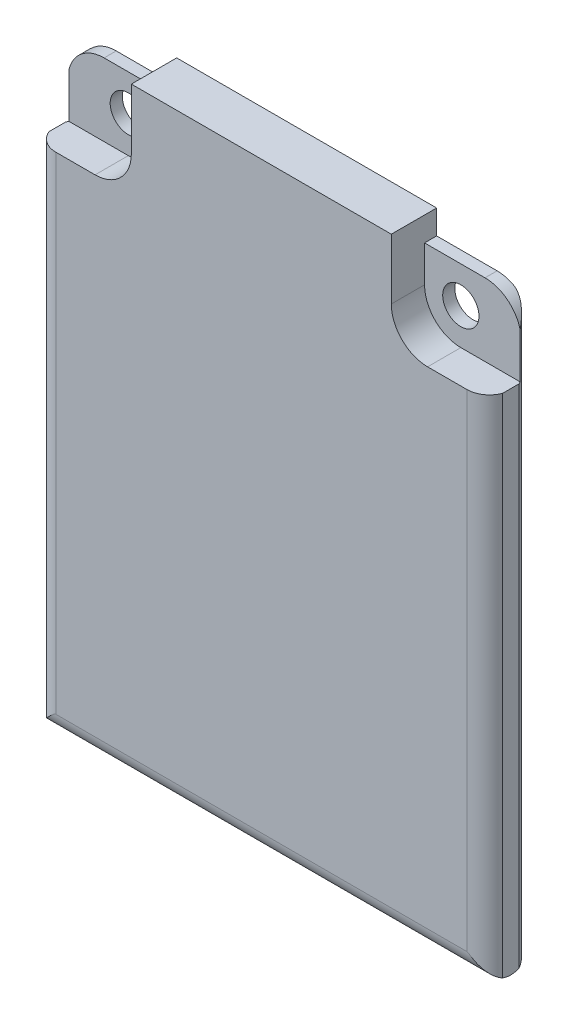
ISO-10303-21;
HEADER;
FILE_DESCRIPTION(('STEP AP214'),'2;1');
FILE_NAME('part.step','',(''),(''),'','','');
FILE_SCHEMA(('AUTOMOTIVE_DESIGN { 1 0 10303 214 1 1 1 1 }'));
ENDSEC;
DATA;
#1=APPLICATION_CONTEXT('core data for automotive mechanical design processes');
#2=APPLICATION_PROTOCOL_DEFINITION('international standard','automotive_design',2000,#1);
#3=PRODUCT_CONTEXT('',#1,'mechanical');
#4=PRODUCT('Part','Part','',(#3));
#5=PRODUCT_RELATED_PRODUCT_CATEGORY('part','',(#4));
#6=PRODUCT_DEFINITION_FORMATION('','',#4);
#7=PRODUCT_DEFINITION_CONTEXT('part definition',#1,'design');
#8=PRODUCT_DEFINITION('design','',#6,#7);
#9=PRODUCT_DEFINITION_SHAPE('','',#8);
#10=(LENGTH_UNIT() NAMED_UNIT(*) SI_UNIT(.MILLI.,.METRE.));
#11=(NAMED_UNIT(*) PLANE_ANGLE_UNIT() SI_UNIT($,.RADIAN.));
#12=(NAMED_UNIT(*) SI_UNIT($,.STERADIAN.) SOLID_ANGLE_UNIT());
#13=UNCERTAINTY_MEASURE_WITH_UNIT(LENGTH_MEASURE(1.E-05),#10,'distance_accuracy_value','');
#14=(GEOMETRIC_REPRESENTATION_CONTEXT(3) GLOBAL_UNCERTAINTY_ASSIGNED_CONTEXT((#13)) GLOBAL_UNIT_ASSIGNED_CONTEXT((#10,
#11,#12)) REPRESENTATION_CONTEXT('',''));
#15=CARTESIAN_POINT('',(0.,0.,0.));
#16=DIRECTION('',(0.,0.,1.));
#17=DIRECTION('',(1.,0.,0.));
#18=AXIS2_PLACEMENT_3D('',#15,#16,#17);
#19=CARTESIAN_POINT('',(0.,17.,3.75));
#20=DIRECTION('',(0.,-1.,0.));
#21=DIRECTION('',(1.,0.,0.));
#22=AXIS2_PLACEMENT_3D('',#19,#20,#21);
#23=PLANE('',#22);
#24=CARTESIAN_POINT('',(-17.,17.,1.875));
#25=DIRECTION('',(0.,-1.,0.));
#26=DIRECTION('',(1.,0.,0.));
#27=AXIS2_PLACEMENT_3D('',#24,#25,#26);
#28=CIRCLE('',#27,1.875);
#29=CARTESIAN_POINT('',(-17.,17.,3.75));
#30=VERTEX_POINT('',#29);
#31=CARTESIAN_POINT('',(-18.75,17.,2.54814560089184));
#32=VERTEX_POINT('',#31);
#33=EDGE_CURVE('E454',#30,#32,#28,.T.);
#34=ORIENTED_EDGE('',*,*,#33,.F.);
#35=DIRECTION('',(-1.,0.,0.));
#36=VECTOR('',#35,1.);
#37=CARTESIAN_POINT('',(0.,17.,3.75));
#38=LINE('',#37,#36);
#39=CARTESIAN_POINT('',(-13.75,17.,3.75));
#40=VERTEX_POINT('',#39);
#41=EDGE_CURVE('E272',#40,#30,#38,.T.);
#42=ORIENTED_EDGE('',*,*,#41,.F.);
#43=DIRECTION('',(0.,0.,-1.));
#44=VECTOR('',#43,1.);
#45=CARTESIAN_POINT('',(-13.75,17.,3.75));
#46=LINE('',#45,#44);
#47=CARTESIAN_POINT('',(-13.75,17.,1.));
#48=VERTEX_POINT('',#47);
#49=EDGE_CURVE('E309',#40,#48,#46,.T.);
#50=ORIENTED_EDGE('',*,*,#49,.T.);
#51=DIRECTION('',(-1.,0.,0.));
#52=VECTOR('',#51,1.);
#53=CARTESIAN_POINT('',(0.,17.,1.));
#54=LINE('',#53,#52);
#55=CARTESIAN_POINT('',(-18.6583123951777,17.,1.));
#56=VERTEX_POINT('',#55);
#57=EDGE_CURVE('E400',#48,#56,#54,.T.);
#58=ORIENTED_EDGE('',*,*,#57,.T.);
#59=CARTESIAN_POINT('',(-18.75,17.,1.20185439910816));
#60=VERTEX_POINT('',#59);
#61=EDGE_CURVE('E452',#60,#56,#28,.T.);
#62=ORIENTED_EDGE('',*,*,#61,.F.);
#63=DIRECTION('',(0.,0.,-1.));
#64=VECTOR('',#63,1.);
#65=CARTESIAN_POINT('',(-18.75,17.,3.75));
#66=LINE('',#65,#64);
#67=EDGE_CURVE('E306',#32,#60,#66,.T.);
#68=ORIENTED_EDGE('',*,*,#67,.F.);
#69=EDGE_LOOP('',(#34,#42,#50,#58,#62,#68));
#70=FACE_BOUND('',#69,.T.);
#71=ADVANCED_FACE('F52',(#70),#23,.F.);
#72=CARTESIAN_POINT('',(-18.75,0.,3.75));
#73=DIRECTION('',(1.,0.,0.));
#74=DIRECTION('',(0.,1.,0.));
#75=AXIS2_PLACEMENT_3D('',#72,#73,#74);
#76=PLANE('',#75);
#77=DIRECTION('',(0.,1.,0.));
#78=VECTOR('',#77,1.);
#79=CARTESIAN_POINT('',(-18.75,-25.,1.20185439910816));
#80=LINE('',#79,#78);
#81=CARTESIAN_POINT('',(-18.75,-24.8753560892309,1.20185439910816));
#82=VERTEX_POINT('',#81);
#83=EDGE_CURVE('E483',#82,#60,#80,.T.);
#84=ORIENTED_EDGE('',*,*,#83,.F.);
#85=CARTESIAN_POINT('',(-18.75,-23.12,1.875));
#86=DIRECTION('',(-1.,0.,0.));
#87=DIRECTION('',(0.,-1.,0.));
#88=AXIS2_PLACEMENT_3D('',#85,#86,#87);
#89=CIRCLE('',#88,1.88);
#90=CARTESIAN_POINT('',(-18.75,-24.8753560892309,2.54814560089184));
#91=VERTEX_POINT('',#90);
#92=EDGE_CURVE('E387',#91,#82,#89,.F.);
#93=ORIENTED_EDGE('',*,*,#92,.F.);
#94=DIRECTION('',(0.,1.,0.));
#95=VECTOR('',#94,1.);
#96=CARTESIAN_POINT('',(-18.75,-25.,2.54814560089184));
#97=LINE('',#96,#95);
#98=EDGE_CURVE('E202',#32,#91,#97,.F.);
#99=ORIENTED_EDGE('',*,*,#98,.F.);
#100=ORIENTED_EDGE('',*,*,#67,.T.);
#101=EDGE_LOOP('',(#84,#93,#99,#100));
#102=FACE_BOUND('',#101,.T.);
#103=ADVANCED_FACE('F420',(#102),#76,.F.);
#104=CARTESIAN_POINT('',(18.75,0.,3.75));
#105=DIRECTION('',(-1.,0.,0.));
#106=DIRECTION('',(0.,-1.,0.));
#107=AXIS2_PLACEMENT_3D('',#104,#105,#106);
#108=PLANE('',#107);
#109=DIRECTION('',(0.,1.,0.));
#110=VECTOR('',#109,1.);
#111=CARTESIAN_POINT('',(18.75,-25.,2.5481456008918));
#112=LINE('',#111,#110);
#113=CARTESIAN_POINT('',(18.75,-24.8753560892309,2.5481456008918));
#114=VERTEX_POINT('',#113);
#115=CARTESIAN_POINT('',(18.75,17.,2.5481456008918));
#116=VERTEX_POINT('',#115);
#117=EDGE_CURVE('E478',#114,#116,#112,.T.);
#118=ORIENTED_EDGE('',*,*,#117,.F.);
#119=CARTESIAN_POINT('',(18.75,-23.12,1.875));
#120=DIRECTION('',(-1.,0.,0.));
#121=DIRECTION('',(0.,-1.,0.));
#122=AXIS2_PLACEMENT_3D('',#119,#120,#121);
#123=CIRCLE('',#122,1.88);
#124=CARTESIAN_POINT('',(18.75,-24.8753560892309,1.20185439910819));
#125=VERTEX_POINT('',#124);
#126=EDGE_CURVE('E388',#114,#125,#123,.F.);
#127=ORIENTED_EDGE('',*,*,#126,.T.);
#128=DIRECTION('',(0.,1.,0.));
#129=VECTOR('',#128,1.);
#130=CARTESIAN_POINT('',(18.75,-25.,1.20185439910819));
#131=LINE('',#130,#129);
#132=CARTESIAN_POINT('',(18.75,17.,1.20185439910819));
#133=VERTEX_POINT('',#132);
#134=EDGE_CURVE('E79',#133,#125,#131,.F.);
#135=ORIENTED_EDGE('',*,*,#134,.F.);
#136=DIRECTION('',(0.,0.,-1.));
#137=VECTOR('',#136,1.);
#138=CARTESIAN_POINT('',(18.75,17.,3.75));
#139=LINE('',#138,#137);
#140=EDGE_CURVE('E303',#116,#133,#139,.T.);
#141=ORIENTED_EDGE('',*,*,#140,.F.);
#142=EDGE_LOOP('',(#118,#127,#135,#141));
#143=FACE_BOUND('',#142,.T.);
#144=ADVANCED_FACE('F426',(#143),#108,.F.);
#145=CARTESIAN_POINT('',(0.,17.,3.75));
#146=DIRECTION('',(0.,1.,0.));
#147=DIRECTION('',(0.,0.,1.));
#148=AXIS2_PLACEMENT_3D('',#145,#146,#147);
#149=PLANE('',#148);
#150=DIRECTION('',(1.,0.,0.));
#151=VECTOR('',#150,1.);
#152=CARTESIAN_POINT('',(0.,17.,3.75));
#153=LINE('',#152,#151);
#154=CARTESIAN_POINT('',(13.75,17.,3.75));
#155=VERTEX_POINT('',#154);
#156=CARTESIAN_POINT('',(17.,17.,3.75));
#157=VERTEX_POINT('',#156);
#158=EDGE_CURVE('E275',#155,#157,#153,.T.);
#159=ORIENTED_EDGE('',*,*,#158,.T.);
#160=CARTESIAN_POINT('',(17.,17.,1.875));
#161=DIRECTION('',(0.,1.,0.));
#162=DIRECTION('',(0.,0.,1.));
#163=AXIS2_PLACEMENT_3D('',#160,#161,#162);
#164=CIRCLE('',#163,1.875);
#165=EDGE_CURVE('E475',#157,#116,#164,.T.);
#166=ORIENTED_EDGE('',*,*,#165,.T.);
#167=ORIENTED_EDGE('',*,*,#140,.T.);
#168=CARTESIAN_POINT('',(18.6583123951777,17.,1.));
#169=VERTEX_POINT('',#168);
#170=EDGE_CURVE('E473',#133,#169,#164,.T.);
#171=ORIENTED_EDGE('',*,*,#170,.T.);
#172=DIRECTION('',(1.,0.,0.));
#173=VECTOR('',#172,1.);
#174=CARTESIAN_POINT('',(0.,17.,1.));
#175=LINE('',#174,#173);
#176=CARTESIAN_POINT('',(13.75,17.,1.));
#177=VERTEX_POINT('',#176);
#178=EDGE_CURVE('E247',#177,#169,#175,.T.);
#179=ORIENTED_EDGE('',*,*,#178,.F.);
#180=DIRECTION('',(0.,0.,-1.));
#181=VECTOR('',#180,1.);
#182=CARTESIAN_POINT('',(13.75,17.,3.75));
#183=LINE('',#182,#181);
#184=EDGE_CURVE('E300',#155,#177,#183,.T.);
#185=ORIENTED_EDGE('',*,*,#184,.F.);
#186=EDGE_LOOP('',(#159,#166,#167,#171,#179,#185));
#187=FACE_BOUND('',#186,.T.);
#188=ADVANCED_FACE('F416',(#187),#149,.T.);
#189=CARTESIAN_POINT('',(0.,0.,3.75));
#190=DIRECTION('',(0.,0.,1.));
#191=DIRECTION('',(1.,0.,0.));
#192=AXIS2_PLACEMENT_3D('',#189,#190,#191);
#193=PLANE('',#192);
#194=DIRECTION('',(-1.,0.,0.));
#195=VECTOR('',#194,1.);
#196=CARTESIAN_POINT('',(18.75,-23.2570218960605,3.75));
#197=LINE('',#196,#195);
#198=CARTESIAN_POINT('',(17.,-23.2570218960605,3.75));
#199=VERTEX_POINT('',#198);
#200=CARTESIAN_POINT('',(-17.,-23.2570218960604,3.75));
#201=VERTEX_POINT('',#200);
#202=EDGE_CURVE('E391',#199,#201,#197,.T.);
#203=ORIENTED_EDGE('',*,*,#202,.F.);
#204=DIRECTION('',(0.,1.,0.));
#205=VECTOR('',#204,1.);
#206=CARTESIAN_POINT('',(17.,-25.,3.75));
#207=LINE('',#206,#205);
#208=EDGE_CURVE('E72',#199,#157,#207,.T.);
#209=ORIENTED_EDGE('',*,*,#208,.T.);
#210=ORIENTED_EDGE('',*,*,#158,.F.);
#211=CARTESIAN_POINT('',(13.75,20.,3.75));
#212=DIRECTION('',(0.,0.,1.));
#213=DIRECTION('',(1.,0.,0.));
#214=AXIS2_PLACEMENT_3D('',#211,#212,#213);
#215=CIRCLE('',#214,3.);
#216=CARTESIAN_POINT('',(10.75,20.,3.75));
#217=VERTEX_POINT('',#216);
#218=EDGE_CURVE('E278',#217,#155,#215,.T.);
#219=ORIENTED_EDGE('',*,*,#218,.F.);
#220=DIRECTION('',(0.,-1.,0.));
#221=VECTOR('',#220,1.);
#222=CARTESIAN_POINT('',(10.75,0.,3.75));
#223=LINE('',#222,#221);
#224=CARTESIAN_POINT('',(10.75,25.,3.75));
#225=VERTEX_POINT('',#224);
#226=EDGE_CURVE('E281',#225,#217,#223,.T.);
#227=ORIENTED_EDGE('',*,*,#226,.F.);
#228=DIRECTION('',(1.,0.,0.));
#229=VECTOR('',#228,1.);
#230=CARTESIAN_POINT('',(0.,25.,3.75));
#231=LINE('',#230,#229);
#232=CARTESIAN_POINT('',(-10.75,25.,3.75));
#233=VERTEX_POINT('',#232);
#234=EDGE_CURVE('E284',#233,#225,#231,.T.);
#235=ORIENTED_EDGE('',*,*,#234,.F.);
#236=DIRECTION('',(0.,-1.,0.));
#237=VECTOR('',#236,1.);
#238=CARTESIAN_POINT('',(-10.75,0.,3.75));
#239=LINE('',#238,#237);
#240=CARTESIAN_POINT('',(-10.75,20.,3.75));
#241=VERTEX_POINT('',#240);
#242=EDGE_CURVE('E266',#233,#241,#239,.T.);
#243=ORIENTED_EDGE('',*,*,#242,.T.);
#244=CARTESIAN_POINT('',(-13.75,20.,3.75));
#245=DIRECTION('',(0.,0.,1.));
#246=DIRECTION('',(1.,0.,0.));
#247=AXIS2_PLACEMENT_3D('',#244,#245,#246);
#248=CIRCLE('',#247,3.);
#249=EDGE_CURVE('E269',#241,#40,#248,.F.);
#250=ORIENTED_EDGE('',*,*,#249,.T.);
#251=ORIENTED_EDGE('',*,*,#41,.T.);
#252=DIRECTION('',(0.,1.,0.));
#253=VECTOR('',#252,1.);
#254=CARTESIAN_POINT('',(-17.,-25.,3.75));
#255=LINE('',#254,#253);
#256=EDGE_CURVE('E213',#201,#30,#255,.T.);
#257=ORIENTED_EDGE('',*,*,#256,.F.);
#258=EDGE_LOOP('',(#203,#209,#210,#219,#227,#235,#243,#250,#251,#257));
#259=FACE_BOUND('',#258,.T.);
#260=ADVANCED_FACE('F374',(#259),#193,.T.);
#261=CARTESIAN_POINT('',(0.,0.,0.));
#262=DIRECTION('',(0.,0.,1.));
#263=DIRECTION('',(1.,0.,0.));
#264=AXIS2_PLACEMENT_3D('',#261,#262,#263);
#265=PLANE('',#264);
#266=CARTESIAN_POINT('',(-13.75,20.,0.));
#267=DIRECTION('',(0.,0.,1.));
#268=DIRECTION('',(1.,0.,0.));
#269=AXIS2_PLACEMENT_3D('',#266,#267,#268);
#270=CIRCLE('',#269,1.5);
#271=CARTESIAN_POINT('',(-12.25,20.,0.));
#272=VERTEX_POINT('',#271);
#273=EDGE_CURVE('E226',#272,#272,#270,.T.);
#274=ORIENTED_EDGE('',*,*,#273,.T.);
#275=EDGE_LOOP('',(#274));
#276=FACE_BOUND('',#275,.T.);
#277=CARTESIAN_POINT('',(13.75,20.,0.));
#278=DIRECTION('',(0.,0.,1.));
#279=DIRECTION('',(1.,0.,0.));
#280=AXIS2_PLACEMENT_3D('',#277,#278,#279);
#281=CIRCLE('',#280,1.5);
#282=CARTESIAN_POINT('',(15.25,20.,0.));
#283=VERTEX_POINT('',#282);
#284=EDGE_CURVE('E240',#283,#283,#281,.T.);
#285=ORIENTED_EDGE('',*,*,#284,.T.);
#286=EDGE_LOOP('',(#285));
#287=FACE_BOUND('',#286,.T.);
#288=DIRECTION('',(0.,1.,0.));
#289=VECTOR('',#288,1.);
#290=CARTESIAN_POINT('',(17.,-25.,0.));
#291=LINE('',#290,#289);
#292=CARTESIAN_POINT('',(17.,-23.2570218960604,0.));
#293=VERTEX_POINT('',#292);
#294=CARTESIAN_POINT('',(17.,22.7271780286589,0.));
#295=VERTEX_POINT('',#294);
#296=EDGE_CURVE('E214',#293,#295,#291,.T.);
#297=ORIENTED_EDGE('',*,*,#296,.F.);
#298=DIRECTION('',(-1.,0.,0.));
#299=VECTOR('',#298,1.);
#300=CARTESIAN_POINT('',(18.75,-23.2570218960604,0.));
#301=LINE('',#300,#299);
#302=CARTESIAN_POINT('',(-17.,-23.2570218960604,0.));
#303=VERTEX_POINT('',#302);
#304=EDGE_CURVE('E212',#293,#303,#301,.T.);
#305=ORIENTED_EDGE('',*,*,#304,.T.);
#306=DIRECTION('',(0.,1.,0.));
#307=VECTOR('',#306,1.);
#308=CARTESIAN_POINT('',(-17.,-25.,0.));
#309=LINE('',#308,#307);
#310=CARTESIAN_POINT('',(-17.,22.7271780286589,0.));
#311=VERTEX_POINT('',#310);
#312=EDGE_CURVE('E195',#303,#311,#309,.T.);
#313=ORIENTED_EDGE('',*,*,#312,.T.);
#314=CARTESIAN_POINT('',(-15.75,20.,0.));
#315=DIRECTION('',(0.,0.,1.));
#316=DIRECTION('',(1.,0.,0.));
#317=AXIS2_PLACEMENT_3D('',#314,#315,#316);
#318=CIRCLE('',#317,3.);
#319=CARTESIAN_POINT('',(-15.75,23.,0.));
#320=VERTEX_POINT('',#319);
#321=EDGE_CURVE('E209',#320,#311,#318,.T.);
#322=ORIENTED_EDGE('',*,*,#321,.F.);
#323=DIRECTION('',(-1.,0.,0.));
#324=VECTOR('',#323,1.);
#325=CARTESIAN_POINT('',(0.,23.,0.));
#326=LINE('',#325,#324);
#327=CARTESIAN_POINT('',(-10.75,23.,0.));
#328=VERTEX_POINT('',#327);
#329=EDGE_CURVE('E221',#328,#320,#326,.T.);
#330=ORIENTED_EDGE('',*,*,#329,.F.);
#331=DIRECTION('',(0.,-1.,0.));
#332=VECTOR('',#331,1.);
#333=CARTESIAN_POINT('',(-10.75,0.,0.));
#334=LINE('',#333,#332);
#335=CARTESIAN_POINT('',(-10.75,25.,0.));
#336=VERTEX_POINT('',#335);
#337=EDGE_CURVE('E265',#336,#328,#334,.T.);
#338=ORIENTED_EDGE('',*,*,#337,.F.);
#339=DIRECTION('',(1.,0.,0.));
#340=VECTOR('',#339,1.);
#341=CARTESIAN_POINT('',(0.,25.,0.));
#342=LINE('',#341,#340);
#343=CARTESIAN_POINT('',(10.75,25.,0.));
#344=VERTEX_POINT('',#343);
#345=EDGE_CURVE('E270',#336,#344,#342,.T.);
#346=ORIENTED_EDGE('',*,*,#345,.T.);
#347=DIRECTION('',(0.,-1.,0.));
#348=VECTOR('',#347,1.);
#349=CARTESIAN_POINT('',(10.75,0.,0.));
#350=LINE('',#349,#348);
#351=CARTESIAN_POINT('',(10.75,23.,0.));
#352=VERTEX_POINT('',#351);
#353=EDGE_CURVE('E289',#344,#352,#350,.T.);
#354=ORIENTED_EDGE('',*,*,#353,.T.);
#355=DIRECTION('',(1.,0.,0.));
#356=VECTOR('',#355,1.);
#357=CARTESIAN_POINT('',(0.,23.,0.));
#358=LINE('',#357,#356);
#359=CARTESIAN_POINT('',(15.75,23.,0.));
#360=VERTEX_POINT('',#359);
#361=EDGE_CURVE('E256',#352,#360,#358,.T.);
#362=ORIENTED_EDGE('',*,*,#361,.T.);
#363=CARTESIAN_POINT('',(15.75,20.,0.));
#364=DIRECTION('',(0.,0.,1.));
#365=DIRECTION('',(1.,0.,0.));
#366=AXIS2_PLACEMENT_3D('',#363,#364,#365);
#367=CIRCLE('',#366,3.);
#368=EDGE_CURVE('E235',#360,#295,#367,.F.);
#369=ORIENTED_EDGE('',*,*,#368,.T.);
#370=EDGE_LOOP('',(#297,#305,#313,#322,#330,#338,#346,#354,#362,#369));
#371=FACE_BOUND('',#370,.T.);
#372=ADVANCED_FACE('F207',(#276,#287,#371),#265,.F.);
#373=CARTESIAN_POINT('',(15.75,20.,1.));
#374=DIRECTION('',(0.,0.,-1.));
#375=DIRECTION('',(-1.,0.,0.));
#376=AXIS2_PLACEMENT_3D('',#373,#374,#375);
#377=CYLINDRICAL_SURFACE('',#376,3.);
#378=CARTESIAN_POINT('',(15.75,20.,1.));
#379=DIRECTION('',(0.,0.,1.));
#380=DIRECTION('',(1.,0.,0.));
#381=AXIS2_PLACEMENT_3D('',#378,#379,#380);
#382=CIRCLE('',#381,3.);
#383=CARTESIAN_POINT('',(15.75,23.,1.));
#384=VERTEX_POINT('',#383);
#385=CARTESIAN_POINT('',(18.6583123951777,20.736015633024,1.));
#386=VERTEX_POINT('',#385);
#387=EDGE_CURVE('E236',#384,#386,#382,.F.);
#388=ORIENTED_EDGE('',*,*,#387,.T.);
#389=CARTESIAN_POINT('',(18.6583123951777,20.736015633024,1.));
#390=CARTESIAN_POINT('',(18.6469151633582,20.7810265436928,0.978383695070677));
#391=CARTESIAN_POINT('',(18.6345741281256,20.8254230698185,0.956034489208237));
#392=CARTESIAN_POINT('',(18.6080273215763,20.9131190163062,0.910342448061663));
#393=CARTESIAN_POINT('',(18.5938220945094,20.9564187524906,0.886999904120916));
#394=CARTESIAN_POINT('',(18.5484154287706,21.0849603826171,0.816141992165832));
#395=CARTESIAN_POINT('',(18.5144367515276,21.1687909358852,0.767823448373397));
#396=CARTESIAN_POINT('',(18.4383765760621,21.3345726008704,0.670598098308575));
#397=CARTESIAN_POINT('',(18.3961656860059,21.4164665338406,0.621695480188995));
#398=CARTESIAN_POINT('',(18.3038292900456,21.5768681038966,0.52589657173632));
#399=CARTESIAN_POINT('',(18.2537076982671,21.6553773913365,0.47899930368682));
#400=CARTESIAN_POINT('',(18.1606629597488,21.7869584859985,0.401555582287939));
#401=CARTESIAN_POINT('',(18.1197307675557,21.8409288575326,0.37014451870001));
#402=CARTESIAN_POINT('',(18.0336072503825,21.9467413090445,0.309735714320903));
#403=CARTESIAN_POINT('',(17.9884162429722,21.998583547299,0.280737793890534));
#404=CARTESIAN_POINT('',(17.8471425291157,22.1496089798837,0.198774479552232));
#405=CARTESIAN_POINT('',(17.744575068301,22.2454147884618,0.150159806075704));
#406=CARTESIAN_POINT('',(17.5868443545237,22.3726908445298,0.0935023633313473));
#407=CARTESIAN_POINT('',(17.5383864832457,22.4094448074854,0.0782151697380043));
#408=CARTESIAN_POINT('',(17.4386503271966,22.4803624509439,0.0513015649321507));
#409=CARTESIAN_POINT('',(17.3873735795584,22.5145275194634,0.0396731813812024));
#410=CARTESIAN_POINT('',(17.2814367440185,22.5804348733538,0.0204496784019765));
#411=CARTESIAN_POINT('',(17.226737280868,22.6121328253313,0.0129180611049755));
#412=CARTESIAN_POINT('',(17.1149964531235,22.6722355851597,0.00268532096589317));
#413=CARTESIAN_POINT('',(17.0579508701185,22.7006340755424,-6.67353141690896E-06));
#414=CARTESIAN_POINT('',(17.,22.7271780286589,0.));
#415=B_SPLINE_CURVE_WITH_KNOTS('',3,(#389,#390,#391,#392,#393,#394,#395,#396,#397,#398,#399,
#400,#401,#402,#403,#404,#405,#406,#407,#408,#409,#410,#411,#412,#413,#414),.UNSPECIFIED.,.F.,
.F.,(4,2,2,2,2,2,2,2,2,2,2,2,4),(0.,0.15359993157319,0.307155119077245,0.614450141504304,
0.927033987337207,1.23946365230341,1.46327051822214,1.68706070857961,2.13009201440242,
2.31805766165528,2.50592180881527,2.69662049594543,2.88767849708265),.UNSPECIFIED.);
#416=EDGE_CURVE('E377',#386,#295,#415,.T.);
#417=ORIENTED_EDGE('',*,*,#416,.T.);
#418=ORIENTED_EDGE('',*,*,#368,.F.);
#419=DIRECTION('',(0.,0.,-1.));
#420=VECTOR('',#419,1.);
#421=CARTESIAN_POINT('',(15.75,23.,1.));
#422=LINE('',#421,#420);
#423=EDGE_CURVE('E263',#384,#360,#422,.T.);
#424=ORIENTED_EDGE('',*,*,#423,.F.);
#425=EDGE_LOOP('',(#388,#417,#418,#424));
#426=FACE_BOUND('',#425,.T.);
#427=ADVANCED_FACE('F360',(#426),#377,.T.);
#428=CARTESIAN_POINT('',(0.,0.,1.));
#429=DIRECTION('',(0.,0.,1.));
#430=DIRECTION('',(1.,0.,0.));
#431=AXIS2_PLACEMENT_3D('',#428,#429,#430);
#432=PLANE('',#431);
#433=CARTESIAN_POINT('',(13.75,20.,1.));
#434=DIRECTION('',(0.,0.,1.));
#435=DIRECTION('',(1.,0.,0.));
#436=AXIS2_PLACEMENT_3D('',#433,#434,#435);
#437=CIRCLE('',#436,1.5);
#438=CARTESIAN_POINT('',(15.25,20.,1.));
#439=VERTEX_POINT('',#438);
#440=EDGE_CURVE('E250',#439,#439,#437,.T.);
#441=ORIENTED_EDGE('',*,*,#440,.F.);
#442=EDGE_LOOP('',(#441));
#443=FACE_BOUND('',#442,.T.);
#444=ORIENTED_EDGE('',*,*,#178,.T.);
#445=DIRECTION('',(0.,1.,0.));
#446=VECTOR('',#445,1.);
#447=CARTESIAN_POINT('',(18.6583123951777,-25.,1.));
#448=LINE('',#447,#446);
#449=EDGE_CURVE('E384',#169,#386,#448,.T.);
#450=ORIENTED_EDGE('',*,*,#449,.T.);
#451=ORIENTED_EDGE('',*,*,#387,.F.);
#452=DIRECTION('',(1.,0.,0.));
#453=VECTOR('',#452,1.);
#454=CARTESIAN_POINT('',(0.,23.,1.));
#455=LINE('',#454,#453);
#456=CARTESIAN_POINT('',(10.75,23.,1.));
#457=VERTEX_POINT('',#456);
#458=EDGE_CURVE('E239',#457,#384,#455,.T.);
#459=ORIENTED_EDGE('',*,*,#458,.F.);
#460=DIRECTION('',(0.,-1.,0.));
#461=VECTOR('',#460,1.);
#462=CARTESIAN_POINT('',(10.75,0.,1.));
#463=LINE('',#462,#461);
#464=CARTESIAN_POINT('',(10.75,20.,1.));
#465=VERTEX_POINT('',#464);
#466=EDGE_CURVE('E243',#457,#465,#463,.T.);
#467=ORIENTED_EDGE('',*,*,#466,.T.);
#468=CARTESIAN_POINT('',(13.75,20.,1.));
#469=DIRECTION('',(0.,0.,1.));
#470=DIRECTION('',(1.,0.,0.));
#471=AXIS2_PLACEMENT_3D('',#468,#469,#470);
#472=CIRCLE('',#471,3.);
#473=EDGE_CURVE('E245',#465,#177,#472,.T.);
#474=ORIENTED_EDGE('',*,*,#473,.T.);
#475=EDGE_LOOP('',(#444,#450,#451,#459,#467,#474));
#476=FACE_BOUND('',#475,.T.);
#477=ADVANCED_FACE('F348',(#443,#476),#432,.T.);
#478=CARTESIAN_POINT('',(-15.75,20.,1.));
#479=DIRECTION('',(0.,0.,-1.));
#480=DIRECTION('',(-1.,0.,0.));
#481=AXIS2_PLACEMENT_3D('',#478,#479,#480);
#482=CYLINDRICAL_SURFACE('',#481,3.);
#483=CARTESIAN_POINT('',(-18.6583123951777,20.736015633024,1.));
#484=CARTESIAN_POINT('',(-18.6469151633582,20.7810265436928,0.978383695070677));
#485=CARTESIAN_POINT('',(-18.6345741281256,20.8254230698185,0.956034489208237));
#486=CARTESIAN_POINT('',(-18.6080273215763,20.9131190163062,0.910342448061662));
#487=CARTESIAN_POINT('',(-18.5938220945094,20.9564187524906,0.886999904120915));
#488=CARTESIAN_POINT('',(-18.5484154287706,21.0849603826171,0.81614199216583));
#489=CARTESIAN_POINT('',(-18.5144367515276,21.1687909358852,0.767823448373393));
#490=CARTESIAN_POINT('',(-18.4383765760621,21.3345726008704,0.670598098308571));
#491=CARTESIAN_POINT('',(-18.3961656860059,21.4164665338406,0.621695480188993));
#492=CARTESIAN_POINT('',(-18.3038292900455,21.5768681038966,0.525896571736318));
#493=CARTESIAN_POINT('',(-18.2537076982671,21.6553773913365,0.478999303686817));
#494=CARTESIAN_POINT('',(-18.1606629597488,21.7869584859985,0.401555582287937));
#495=CARTESIAN_POINT('',(-18.1197307675557,21.8409288575326,0.370144518700008));
#496=CARTESIAN_POINT('',(-18.0336072503825,21.9467413090445,0.309735714320902));
#497=CARTESIAN_POINT('',(-17.9884162429722,21.998583547299,0.280737793890532));
#498=CARTESIAN_POINT('',(-17.8471425291157,22.1496089798837,0.19877447955223));
#499=CARTESIAN_POINT('',(-17.744575068301,22.2454147884618,0.150159806075703));
#500=CARTESIAN_POINT('',(-17.5868443545237,22.3726908445298,0.093502363331348));
#501=CARTESIAN_POINT('',(-17.5383864832457,22.4094448074854,0.0782151697380058));
#502=CARTESIAN_POINT('',(-17.4386503271966,22.4803624509439,0.0513015649321533));
#503=CARTESIAN_POINT('',(-17.3873735795584,22.5145275194634,0.0396731813812055));
#504=CARTESIAN_POINT('',(-17.2814367440185,22.5804348733538,0.02044967840198));
#505=CARTESIAN_POINT('',(-17.226737280868,22.6121328253313,0.012918061104979));
#506=CARTESIAN_POINT('',(-17.1149964531235,22.6722355851597,0.00268532096589714));
#507=CARTESIAN_POINT('',(-17.0579508701185,22.7006340755424,-6.67353141270575E-06));
#508=CARTESIAN_POINT('',(-17.,22.7271780286589,0.));
#509=B_SPLINE_CURVE_WITH_KNOTS('',3,(#483,#484,#485,#486,#487,#488,#489,#490,#491,#492,#493,
#494,#495,#496,#497,#498,#499,#500,#501,#502,#503,#504,#505,#506,#507,#508),.UNSPECIFIED.,.F.,
.F.,(4,2,2,2,2,2,2,2,2,2,2,2,4),(0.,0.153599931573191,0.307155119077245,0.61445014150431,
0.927033987337209,1.23946365230342,1.46327051822215,1.68706070857962,2.13009201440242,
2.31805766165528,2.50592180881526,2.69662049594543,2.88767849708264),.UNSPECIFIED.);
#510=CARTESIAN_POINT('',(-18.6583123951777,20.736015633024,1.));
#511=VERTEX_POINT('',#510);
#512=EDGE_CURVE('E192',#511,#311,#509,.T.);
#513=ORIENTED_EDGE('',*,*,#512,.F.);
#514=CARTESIAN_POINT('',(-15.75,20.,1.));
#515=DIRECTION('',(0.,0.,1.));
#516=DIRECTION('',(1.,0.,0.));
#517=AXIS2_PLACEMENT_3D('',#514,#515,#516);
#518=CIRCLE('',#517,3.);
#519=CARTESIAN_POINT('',(-15.75,23.,1.));
#520=VERTEX_POINT('',#519);
#521=EDGE_CURVE('E398',#520,#511,#518,.T.);
#522=ORIENTED_EDGE('',*,*,#521,.F.);
#523=DIRECTION('',(0.,0.,-1.));
#524=VECTOR('',#523,1.);
#525=CARTESIAN_POINT('',(-15.75,23.,1.));
#526=LINE('',#525,#524);
#527=EDGE_CURVE('E218',#520,#320,#526,.T.);
#528=ORIENTED_EDGE('',*,*,#527,.T.);
#529=ORIENTED_EDGE('',*,*,#321,.T.);
#530=EDGE_LOOP('',(#513,#522,#528,#529));
#531=FACE_BOUND('',#530,.T.);
#532=ADVANCED_FACE('F216',(#531),#482,.T.);
#533=CARTESIAN_POINT('',(0.,0.,1.));
#534=DIRECTION('',(0.,0.,1.));
#535=DIRECTION('',(1.,0.,0.));
#536=AXIS2_PLACEMENT_3D('',#533,#534,#535);
#537=PLANE('',#536);
#538=CARTESIAN_POINT('',(-13.75,20.,1.));
#539=DIRECTION('',(0.,0.,1.));
#540=DIRECTION('',(1.,0.,0.));
#541=AXIS2_PLACEMENT_3D('',#538,#539,#540);
#542=CIRCLE('',#541,1.5);
#543=CARTESIAN_POINT('',(-12.25,20.,1.));
#544=VERTEX_POINT('',#543);
#545=EDGE_CURVE('E220',#544,#544,#542,.T.);
#546=ORIENTED_EDGE('',*,*,#545,.F.);
#547=EDGE_LOOP('',(#546));
#548=FACE_BOUND('',#547,.T.);
#549=ORIENTED_EDGE('',*,*,#521,.T.);
#550=DIRECTION('',(0.,1.,0.));
#551=VECTOR('',#550,1.);
#552=CARTESIAN_POINT('',(-18.6583123951777,-25.,1.));
#553=LINE('',#552,#551);
#554=EDGE_CURVE('E198',#511,#56,#553,.F.);
#555=ORIENTED_EDGE('',*,*,#554,.T.);
#556=ORIENTED_EDGE('',*,*,#57,.F.);
#557=CARTESIAN_POINT('',(-13.75,20.,1.));
#558=DIRECTION('',(0.,0.,1.));
#559=DIRECTION('',(1.,0.,0.));
#560=AXIS2_PLACEMENT_3D('',#557,#558,#559);
#561=CIRCLE('',#560,3.);
#562=CARTESIAN_POINT('',(-10.75,20.,1.));
#563=VERTEX_POINT('',#562);
#564=EDGE_CURVE('E403',#563,#48,#561,.F.);
#565=ORIENTED_EDGE('',*,*,#564,.F.);
#566=DIRECTION('',(0.,-1.,0.));
#567=VECTOR('',#566,1.);
#568=CARTESIAN_POINT('',(-10.75,0.,1.));
#569=LINE('',#568,#567);
#570=CARTESIAN_POINT('',(-10.75,23.,1.));
#571=VERTEX_POINT('',#570);
#572=EDGE_CURVE('E233',#571,#563,#569,.T.);
#573=ORIENTED_EDGE('',*,*,#572,.F.);
#574=DIRECTION('',(-1.,0.,0.));
#575=VECTOR('',#574,1.);
#576=CARTESIAN_POINT('',(0.,23.,1.));
#577=LINE('',#576,#575);
#578=EDGE_CURVE('E224',#571,#520,#577,.T.);
#579=ORIENTED_EDGE('',*,*,#578,.T.);
#580=EDGE_LOOP('',(#549,#555,#556,#565,#573,#579));
#581=FACE_BOUND('',#580,.T.);
#582=ADVANCED_FACE('F347',(#548,#581),#537,.T.);
#583=CARTESIAN_POINT('',(18.75,-23.12,1.875));
#584=DIRECTION('',(-1.,0.,0.));
#585=DIRECTION('',(0.,-1.,0.));
#586=AXIS2_PLACEMENT_3D('',#583,#584,#585);
#587=CYLINDRICAL_SURFACE('',#586,1.88);
#588=CARTESIAN_POINT('',(18.75,-24.8753560892309,1.20185439910819));
#589=CARTESIAN_POINT('',(18.7117527112968,-24.8372278428356,1.10250386429312));
#590=CARTESIAN_POINT('',(18.6663200711065,-24.7919393751637,1.00950115416613));
#591=CARTESIAN_POINT('',(18.5648084570247,-24.6907896616528,0.837262313778745));
#592=CARTESIAN_POINT('',(18.5088364553042,-24.6350346647198,0.757901992252526));
#593=CARTESIAN_POINT('',(18.3726270543176,-24.4994307249039,0.592023408824299));
#594=CARTESIAN_POINT('',(18.2899514726884,-24.4171743531407,0.509549060623657));
#595=CARTESIAN_POINT('',(18.1160033914361,-24.2443373123815,0.364015399672645));
#596=CARTESIAN_POINT('',(18.0246973504937,-24.1537242020175,0.301036273020345));
#597=CARTESIAN_POINT('',(17.8747368897741,-24.0053679963603,0.21529962744409));
#598=CARTESIAN_POINT('',(17.8178342216905,-23.9491745606764,0.186582295705263));
#599=CARTESIAN_POINT('',(17.7026211781936,-23.8357800244322,0.135486053150024));
#600=CARTESIAN_POINT('',(17.6443163946758,-23.7785831141415,0.113085418932045));
#601=CARTESIAN_POINT('',(17.5463638156595,-23.6832166520808,0.0809014768991919));
#602=CARTESIAN_POINT('',(17.5071170382044,-23.6451938888574,0.0694183353968796));
#603=CARTESIAN_POINT('',(17.4277258978669,-23.5689884456335,0.0489747521839908));
#604=CARTESIAN_POINT('',(17.3875780594044,-23.5308059032278,0.0400270490700124));
#605=CARTESIAN_POINT('',(17.3264232790172,-23.4739400729623,0.0285155266430657));
#606=CARTESIAN_POINT('',(17.3058265747982,-23.4550027623708,0.0249898525675027));
#607=CARTESIAN_POINT('',(17.2641476595749,-23.4174295351732,0.0185793332616777));
#608=CARTESIAN_POINT('',(17.2430643104883,-23.3987945461211,0.0156962042087917));
#609=CARTESIAN_POINT('',(17.2003485749503,-23.3624682980691,0.0106114031603525));
#610=CARTESIAN_POINT('',(17.1787221414681,-23.3447705298567,0.00840431356032335));
#611=CARTESIAN_POINT('',(17.1341148478554,-23.3111227557068,0.00466741025435413));
#612=CARTESIAN_POINT('',(17.1111428999925,-23.2951628935082,0.00313360946289454));
#613=CARTESIAN_POINT('',(17.0773375675383,-23.2771621331719,0.00157348299335531));
#614=CARTESIAN_POINT('',(17.0678921094502,-23.2726566080595,0.00120415378260684));
#615=CARTESIAN_POINT('',(17.0484922987584,-23.2650770422976,0.000602323956143818));
#616=CARTESIAN_POINT('',(17.0385430541973,-23.2619909576858,0.000368667529000041));
#617=CARTESIAN_POINT('',(17.0237387015382,-23.2589888966919,0.000144519791793234));
#618=CARTESIAN_POINT('',(17.0190482796693,-23.2582613946642,9.08781894878834E-05));
#619=CARTESIAN_POINT('',(17.0095739300496,-23.2572730351512,1.8353468093161E-05));
#620=CARTESIAN_POINT('',(17.0047895374028,-23.2570166658142,-1.95395940332893E-07));
#621=CARTESIAN_POINT('',(17.,-23.2570218960603,0.));
#622=B_SPLINE_CURVE_WITH_KNOTS('',3,(#588,#589,#590,#591,#592,#593,#594,#595,#596,#597,#598,
#599,#600,#601,#602,#603,#604,#605,#606,#607,#608,#609,#610,#611,#612,#613,#614,#615,#616,#617,
#618,#619,#620,#621),.UNSPECIFIED.,.F.,.F.,(4,2,2,2,2,2,2,2,2,2,2,2,2,2,2,2,4),(0.,
0.337547724222017,0.671837988421541,1.09815624682252,1.52620539088916,1.78090307870678,
2.03471385946138,2.20217627272918,2.37046571080348,2.45506357751455,2.539884759077,
2.62400726084397,2.70762465462474,2.73897557142713,2.7700553320695,2.78427361165524,
2.79862665026415),.UNSPECIFIED.);
#623=EDGE_CURVE('E12',#125,#293,#622,.T.);
#624=ORIENTED_EDGE('',*,*,#623,.F.);
#625=ORIENTED_EDGE('',*,*,#126,.F.);
#626=CARTESIAN_POINT('',(17.,-23.2570218960605,3.75));
#627=CARTESIAN_POINT('',(17.0093948456525,-23.2569698238662,3.75000194758249));
#628=CARTESIAN_POINT('',(17.0187026769792,-23.2579861796986,3.7499296821653));
#629=CARTESIAN_POINT('',(17.0367864664063,-23.2616185434969,3.74965977696681));
#630=CARTESIAN_POINT('',(17.0455697691144,-23.2641966419377,3.74946510435183));
#631=CARTESIAN_POINT('',(17.0729937095009,-23.2742231773925,3.74867503415621));
#632=CARTESIAN_POINT('',(17.0907916018846,-23.2838007834123,3.74787923557983));
#633=CARTESIAN_POINT('',(17.12530651601,-23.3051958571471,3.74588913882623));
#634=CARTESIAN_POINT('',(17.1419919369611,-23.3170571881634,3.74468661415165));
#635=CARTESIAN_POINT('',(17.194419646486,-23.3566262533896,3.74024713467104));
#636=CARTESIAN_POINT('',(17.2287491964994,-23.3861163703356,3.73631088014184));
#637=CARTESIAN_POINT('',(17.2962694501323,-23.4461207020791,3.72675461227051));
#638=CARTESIAN_POINT('',(17.3294578102185,-23.4766367961896,3.72113134073437));
#639=CARTESIAN_POINT('',(17.3949142255511,-23.5378404185523,3.70824159191127));
#640=CARTESIAN_POINT('',(17.4271872371911,-23.5685250595199,3.70098743655229));
#641=CARTESIAN_POINT('',(17.4912376137254,-23.6299133573754,3.68480625902414));
#642=CARTESIAN_POINT('',(17.523015302853,-23.6606169868585,3.67588038564523));
#643=CARTESIAN_POINT('',(17.6186231845197,-23.7534225036692,3.64627876070836));
#644=CARTESIAN_POINT('',(17.6818238335122,-23.8153572089547,3.62295633163522));
#645=CARTESIAN_POINT('',(17.8064586051456,-23.9379453496826,3.56906565827597));
#646=CARTESIAN_POINT('',(17.8678912983139,-23.9985977383522,3.53849172570103));
#647=CARTESIAN_POINT('',(17.9885914050473,-24.1180023849557,3.46972434911439));
#648=CARTESIAN_POINT('',(18.0478545916185,-24.1767509103208,3.43151687922305));
#649=CARTESIAN_POINT('',(18.1633581299063,-24.2913787303106,3.34718553441512));
#650=CARTESIAN_POINT('',(18.2196009343115,-24.3472603512932,3.30106821431664));
#651=CARTESIAN_POINT('',(18.340585642833,-24.467550988373,3.18904702274454));
#652=CARTESIAN_POINT('',(18.4043491852196,-24.5310067846047,3.12102863986683));
#653=CARTESIAN_POINT('',(18.5234723282838,-24.649611995338,2.97212343082441));
#654=CARTESIAN_POINT('',(18.5788702050347,-24.7047992319217,2.89129891103697));
#655=CARTESIAN_POINT('',(18.6514259176432,-24.7770995638429,2.76412309151438));
#656=CARTESIAN_POINT('',(18.6730535473827,-24.7986543636245,2.72278774067276));
#657=CARTESIAN_POINT('',(18.7136384959372,-24.8391071052752,2.63743492079975));
#658=CARTESIAN_POINT('',(18.7325887897268,-24.857998057271,2.593410814449));
#659=CARTESIAN_POINT('',(18.75,-24.8753560892309,2.5481456008918));
#660=B_SPLINE_CURVE_WITH_KNOTS('',3,(#626,#627,#628,#629,#630,#631,#632,#633,#634,#635,#636,
#637,#638,#639,#640,#641,#642,#643,#644,#645,#646,#647,#648,#649,#650,#651,#652,#653,#654,#655,
#656,#657,#658,#659),.UNSPECIFIED.,.F.,.F.,(4,2,2,2,2,2,2,2,2,2,2,2,2,2,2,2,4),(0.,
0.0279927425284,0.0553317949063316,0.1155350861711,0.177037147274776,0.313078881531125,
0.449385068079044,0.58469409737648,0.719910482389488,0.994118599601518,1.26854252915481,
1.54347540145385,1.81818153065799,2.15539921759925,2.49102393957776,2.64501134366359,
2.79939557365923),.UNSPECIFIED.);
#661=EDGE_CURVE('E65',#199,#114,#660,.T.);
#662=ORIENTED_EDGE('',*,*,#661,.F.);
#663=ORIENTED_EDGE('',*,*,#202,.T.);
#664=CARTESIAN_POINT('',(-18.75,-24.8753560892309,2.54814560089184));
#665=CARTESIAN_POINT('',(-18.7117527112968,-24.8372278428356,2.64749613570692));
#666=CARTESIAN_POINT('',(-18.6663200711065,-24.7919393751637,2.74049884583391));
#667=CARTESIAN_POINT('',(-18.5648084570247,-24.6907896616527,2.91273768622129));
#668=CARTESIAN_POINT('',(-18.5088364553042,-24.6350346647198,2.99209800774751));
#669=CARTESIAN_POINT('',(-18.3726270543175,-24.4994307249038,3.15797659117574));
#670=CARTESIAN_POINT('',(-18.2899514726884,-24.4171743531407,3.24045093937638));
#671=CARTESIAN_POINT('',(-18.1160033914361,-24.2443373123814,3.38598460032739));
#672=CARTESIAN_POINT('',(-18.0246973504937,-24.1537242020174,3.44896372697968));
#673=CARTESIAN_POINT('',(-17.874736889774,-24.0053679963603,3.53470037255593));
#674=CARTESIAN_POINT('',(-17.8178342216904,-23.9491745606764,3.56341770429476));
#675=CARTESIAN_POINT('',(-17.7026211781935,-23.8357800244322,3.61451394684999));
#676=CARTESIAN_POINT('',(-17.6443163946757,-23.7785831141415,3.63691458106797));
#677=CARTESIAN_POINT('',(-17.5463638156595,-23.6832166520808,3.66909852310082));
#678=CARTESIAN_POINT('',(-17.5071170382044,-23.6451938888574,3.68058166460313));
#679=CARTESIAN_POINT('',(-17.4277258978669,-23.5689884456335,3.70102524781602));
#680=CARTESIAN_POINT('',(-17.3875780594043,-23.5308059032278,3.70997295092999));
#681=CARTESIAN_POINT('',(-17.3264232790171,-23.4739400729623,3.72148447335694));
#682=CARTESIAN_POINT('',(-17.3058265747982,-23.4550027623708,3.7250101474325));
#683=CARTESIAN_POINT('',(-17.2641476595749,-23.4174295351732,3.73142066673832));
#684=CARTESIAN_POINT('',(-17.2430643104882,-23.3987945461211,3.73430379579121));
#685=CARTESIAN_POINT('',(-17.2003485749503,-23.3624682980691,3.73938859683965));
#686=CARTESIAN_POINT('',(-17.1787221414681,-23.3447705298567,3.74159568643968));
#687=CARTESIAN_POINT('',(-17.1341148478553,-23.3111227557069,3.74533258974565));
#688=CARTESIAN_POINT('',(-17.1111428999925,-23.2951628935083,3.74686639053711));
#689=CARTESIAN_POINT('',(-17.0773375675383,-23.277162133172,3.74842651700664));
#690=CARTESIAN_POINT('',(-17.0678921094502,-23.2726566080596,3.74879584621739));
#691=CARTESIAN_POINT('',(-17.0484922987583,-23.2650770422977,3.74939767604385));
#692=CARTESIAN_POINT('',(-17.0385430541973,-23.2619909576859,3.749631332471));
#693=CARTESIAN_POINT('',(-17.0237387015381,-23.2589888966919,3.7498554802082));
#694=CARTESIAN_POINT('',(-17.0190482796692,-23.2582613946643,3.74990912181051));
#695=CARTESIAN_POINT('',(-17.0095739300495,-23.2572730351513,3.7499816465319));
#696=CARTESIAN_POINT('',(-17.0047895374028,-23.2570166658143,3.75000019539594));
#697=CARTESIAN_POINT('',(-17.,-23.2570218960604,3.75));
#698=B_SPLINE_CURVE_WITH_KNOTS('',3,(#664,#665,#666,#667,#668,#669,#670,#671,#672,#673,#674,
#675,#676,#677,#678,#679,#680,#681,#682,#683,#684,#685,#686,#687,#688,#689,#690,#691,#692,#693,
#694,#695,#696,#697),.UNSPECIFIED.,.F.,.F.,(4,2,2,2,2,2,2,2,2,2,2,2,2,2,2,2,4),(0.,
0.337547724222027,0.671837988421553,1.09815624682254,1.5262053908892,1.78090307870681,
2.0347138594614,2.20217627272918,2.37046571080346,2.45506357751452,2.53988475907697,
2.62400726084394,2.7076246546247,2.73897557142709,2.77005533206946,2.78427361165518,
2.79862665026405),.UNSPECIFIED.);
#699=EDGE_CURVE('E321',#91,#201,#698,.T.);
#700=ORIENTED_EDGE('',*,*,#699,.F.);
#701=ORIENTED_EDGE('',*,*,#92,.T.);
#702=CARTESIAN_POINT('',(-17.,-23.2570218960604,0.));
#703=CARTESIAN_POINT('',(-17.0093948456524,-23.2569698238661,-1.94758249418508E-06));
#704=CARTESIAN_POINT('',(-17.0187026769792,-23.2579861796986,7.03178347016888E-05));
#705=CARTESIAN_POINT('',(-17.0367864664063,-23.2616185434968,0.000340223033189271));
#706=CARTESIAN_POINT('',(-17.0455697691143,-23.2641966419376,0.000534895648167568));
#707=CARTESIAN_POINT('',(-17.0729937095008,-23.2742231773924,0.00132496584378569));
#708=CARTESIAN_POINT('',(-17.0907916018845,-23.2838007834122,0.00212076442016458));
#709=CARTESIAN_POINT('',(-17.1253065160099,-23.305195857147,0.00411086117375839));
#710=CARTESIAN_POINT('',(-17.141991936961,-23.3170571881633,0.00531338584834356));
#711=CARTESIAN_POINT('',(-17.1944196464859,-23.3566262533894,0.00975286532894413));
#712=CARTESIAN_POINT('',(-17.2287491964992,-23.3861163703355,0.0136891198581437));
#713=CARTESIAN_POINT('',(-17.2962694501321,-23.4461207020789,0.0232453877294615));
#714=CARTESIAN_POINT('',(-17.3294578102184,-23.4766367961894,0.0288686592655995));
#715=CARTESIAN_POINT('',(-17.3949142255509,-23.5378404185521,0.0417584080886857));
#716=CARTESIAN_POINT('',(-17.4271872371909,-23.5685250595197,0.0490125634476572));
#717=CARTESIAN_POINT('',(-17.4912376137251,-23.6299133573752,0.0651937409757953));
#718=CARTESIAN_POINT('',(-17.5230153028527,-23.6606169868583,0.0741196143546916));
#719=CARTESIAN_POINT('',(-17.6186231845194,-23.7534225036689,0.103721239291531));
#720=CARTESIAN_POINT('',(-17.6818238335119,-23.8153572089544,0.127043668364645));
#721=CARTESIAN_POINT('',(-17.8064586051452,-23.9379453496822,0.180934341723841));
#722=CARTESIAN_POINT('',(-17.8678912983134,-23.9985977383518,0.211508274298751));
#723=CARTESIAN_POINT('',(-17.9885914050469,-24.1180023849552,0.280275650885316));
#724=CARTESIAN_POINT('',(-18.047854591618,-24.1767509103203,0.31848312077662));
#725=CARTESIAN_POINT('',(-18.1633581299057,-24.29137873031,0.402814465584462));
#726=CARTESIAN_POINT('',(-18.219600934311,-24.3472603512926,0.448931785682889));
#727=CARTESIAN_POINT('',(-18.3405856428325,-24.4675509883725,0.560952977254913));
#728=CARTESIAN_POINT('',(-18.4043491852191,-24.5310067846042,0.628971360132607));
#729=CARTESIAN_POINT('',(-18.5234723282834,-24.6496119953376,0.777876569174997));
#730=CARTESIAN_POINT('',(-18.5788702050344,-24.7047992319213,0.858701088962423));
#731=CARTESIAN_POINT('',(-18.6514259176429,-24.7770995638426,0.985876908485085));
#732=CARTESIAN_POINT('',(-18.6730535473825,-24.7986543636243,1.0272122593268));
#733=CARTESIAN_POINT('',(-18.7136384959371,-24.8391071052751,1.11256507919999));
#734=CARTESIAN_POINT('',(-18.7325887897267,-24.8579980572709,1.15658918555085));
#735=CARTESIAN_POINT('',(-18.75,-24.8753560892309,1.20185439910816));
#736=B_SPLINE_CURVE_WITH_KNOTS('',3,(#702,#703,#704,#705,#706,#707,#708,#709,#710,#711,#712,
#713,#714,#715,#716,#717,#718,#719,#720,#721,#722,#723,#724,#725,#726,#727,#728,#729,#730,#731,
#732,#733,#734,#735),.UNSPECIFIED.,.F.,.F.,(4,2,2,2,2,2,2,2,2,2,2,2,2,2,2,2,4),(0.,
0.0279927425283852,0.0553317949062991,0.115535086171042,0.17703714727469,0.313078881530969,
0.449385068078823,0.58469409737619,0.719910482389138,0.99411859960103,1.26854252915418,
1.54347540145309,1.8181815306571,2.15539921759843,2.49102393957702,2.64501134366322,
2.79939557365924),.UNSPECIFIED.);
#737=EDGE_CURVE('E315',#303,#82,#736,.T.);
#738=ORIENTED_EDGE('',*,*,#737,.F.);
#739=ORIENTED_EDGE('',*,*,#304,.F.);
#740=EDGE_LOOP('',(#624,#625,#662,#663,#700,#701,#738,#739));
#741=FACE_BOUND('',#740,.T.);
#742=ADVANCED_FACE('F325',(#741),#587,.T.);
#743=CARTESIAN_POINT('',(-10.75,0.,3.75));
#744=DIRECTION('',(1.,0.,0.));
#745=DIRECTION('',(0.,1.,0.));
#746=AXIS2_PLACEMENT_3D('',#743,#744,#745);
#747=PLANE('',#746);
#748=DIRECTION('',(0.,0.,-1.));
#749=VECTOR('',#748,1.);
#750=CARTESIAN_POINT('',(-10.75,23.,1.));
#751=LINE('',#750,#749);
#752=EDGE_CURVE('E230',#571,#328,#751,.T.);
#753=ORIENTED_EDGE('',*,*,#752,.F.);
#754=ORIENTED_EDGE('',*,*,#572,.T.);
#755=DIRECTION('',(0.,0.,-1.));
#756=VECTOR('',#755,1.);
#757=CARTESIAN_POINT('',(-10.75,20.,3.75));
#758=LINE('',#757,#756);
#759=EDGE_CURVE('E312',#241,#563,#758,.T.);
#760=ORIENTED_EDGE('',*,*,#759,.F.);
#761=ORIENTED_EDGE('',*,*,#242,.F.);
#762=DIRECTION('',(0.,0.,-1.));
#763=VECTOR('',#762,1.);
#764=CARTESIAN_POINT('',(-10.75,25.,3.75));
#765=LINE('',#764,#763);
#766=EDGE_CURVE('E287',#233,#336,#765,.T.);
#767=ORIENTED_EDGE('',*,*,#766,.T.);
#768=ORIENTED_EDGE('',*,*,#337,.T.);
#769=EDGE_LOOP('',(#753,#754,#760,#761,#767,#768));
#770=FACE_BOUND('',#769,.T.);
#771=ADVANCED_FACE('F54',(#770),#747,.F.);
#772=CARTESIAN_POINT('',(-13.75,20.,3.75));
#773=DIRECTION('',(0.,0.,-1.));
#774=DIRECTION('',(-1.,0.,0.));
#775=AXIS2_PLACEMENT_3D('',#772,#773,#774);
#776=CYLINDRICAL_SURFACE('',#775,3.);
#777=ORIENTED_EDGE('',*,*,#759,.T.);
#778=ORIENTED_EDGE('',*,*,#564,.T.);
#779=ORIENTED_EDGE('',*,*,#49,.F.);
#780=ORIENTED_EDGE('',*,*,#249,.F.);
#781=EDGE_LOOP('',(#777,#778,#779,#780));
#782=FACE_BOUND('',#781,.T.);
#783=ADVANCED_FACE('F431',(#782),#776,.F.);
#784=CARTESIAN_POINT('',(13.75,20.,3.75));
#785=DIRECTION('',(0.,0.,-1.));
#786=DIRECTION('',(-1.,0.,0.));
#787=AXIS2_PLACEMENT_3D('',#784,#785,#786);
#788=CYLINDRICAL_SURFACE('',#787,3.);
#789=ORIENTED_EDGE('',*,*,#473,.F.);
#790=DIRECTION('',(0.,0.,-1.));
#791=VECTOR('',#790,1.);
#792=CARTESIAN_POINT('',(10.75,20.,3.75));
#793=LINE('',#792,#791);
#794=EDGE_CURVE('E297',#217,#465,#793,.T.);
#795=ORIENTED_EDGE('',*,*,#794,.F.);
#796=ORIENTED_EDGE('',*,*,#218,.T.);
#797=ORIENTED_EDGE('',*,*,#184,.T.);
#798=EDGE_LOOP('',(#789,#795,#796,#797));
#799=FACE_BOUND('',#798,.T.);
#800=ADVANCED_FACE('F433',(#799),#788,.F.);
#801=CARTESIAN_POINT('',(10.75,0.,3.75));
#802=DIRECTION('',(1.,0.,0.));
#803=DIRECTION('',(0.,0.,-1.));
#804=AXIS2_PLACEMENT_3D('',#801,#802,#803);
#805=PLANE('',#804);
#806=DIRECTION('',(0.,0.,-1.));
#807=VECTOR('',#806,1.);
#808=CARTESIAN_POINT('',(10.75,23.,1.));
#809=LINE('',#808,#807);
#810=EDGE_CURVE('E253',#457,#352,#809,.T.);
#811=ORIENTED_EDGE('',*,*,#810,.T.);
#812=ORIENTED_EDGE('',*,*,#353,.F.);
#813=DIRECTION('',(0.,0.,-1.));
#814=VECTOR('',#813,1.);
#815=CARTESIAN_POINT('',(10.75,25.,3.75));
#816=LINE('',#815,#814);
#817=EDGE_CURVE('E295',#225,#344,#816,.T.);
#818=ORIENTED_EDGE('',*,*,#817,.F.);
#819=ORIENTED_EDGE('',*,*,#226,.T.);
#820=ORIENTED_EDGE('',*,*,#794,.T.);
#821=ORIENTED_EDGE('',*,*,#466,.F.);
#822=EDGE_LOOP('',(#811,#812,#818,#819,#820,#821));
#823=FACE_BOUND('',#822,.T.);
#824=ADVANCED_FACE('F439',(#823),#805,.T.);
#825=CARTESIAN_POINT('',(0.,25.,3.75));
#826=DIRECTION('',(0.,1.,0.));
#827=DIRECTION('',(0.,0.,1.));
#828=AXIS2_PLACEMENT_3D('',#825,#826,#827);
#829=PLANE('',#828);
#830=ORIENTED_EDGE('',*,*,#345,.F.);
#831=ORIENTED_EDGE('',*,*,#766,.F.);
#832=ORIENTED_EDGE('',*,*,#234,.T.);
#833=ORIENTED_EDGE('',*,*,#817,.T.);
#834=EDGE_LOOP('',(#830,#831,#832,#833));
#835=FACE_BOUND('',#834,.T.);
#836=ADVANCED_FACE('F368',(#835),#829,.T.);
#837=CARTESIAN_POINT('',(0.,23.,1.));
#838=DIRECTION('',(0.,1.,0.));
#839=DIRECTION('',(0.,0.,1.));
#840=AXIS2_PLACEMENT_3D('',#837,#838,#839);
#841=PLANE('',#840);
#842=ORIENTED_EDGE('',*,*,#361,.F.);
#843=ORIENTED_EDGE('',*,*,#810,.F.);
#844=ORIENTED_EDGE('',*,*,#458,.T.);
#845=ORIENTED_EDGE('',*,*,#423,.T.);
#846=EDGE_LOOP('',(#842,#843,#844,#845));
#847=FACE_BOUND('',#846,.T.);
#848=ADVANCED_FACE('F364',(#847),#841,.T.);
#849=CARTESIAN_POINT('',(13.75,20.,1.));
#850=DIRECTION('',(0.,0.,-1.));
#851=DIRECTION('',(-1.,0.,0.));
#852=AXIS2_PLACEMENT_3D('',#849,#850,#851);
#853=CYLINDRICAL_SURFACE('',#852,1.5);
#854=ORIENTED_EDGE('',*,*,#440,.T.);
#855=EDGE_LOOP('',(#854));
#856=FACE_BOUND('',#855,.T.);
#857=ORIENTED_EDGE('',*,*,#284,.F.);
#858=EDGE_LOOP('',(#857));
#859=FACE_BOUND('',#858,.T.);
#860=ADVANCED_FACE('F353',(#856,#859),#853,.F.);
#861=CARTESIAN_POINT('',(0.,23.,1.));
#862=DIRECTION('',(0.,-1.,0.));
#863=DIRECTION('',(0.,0.,-1.));
#864=AXIS2_PLACEMENT_3D('',#861,#862,#863);
#865=PLANE('',#864);
#866=ORIENTED_EDGE('',*,*,#329,.T.);
#867=ORIENTED_EDGE('',*,*,#527,.F.);
#868=ORIENTED_EDGE('',*,*,#578,.F.);
#869=ORIENTED_EDGE('',*,*,#752,.T.);
#870=EDGE_LOOP('',(#866,#867,#868,#869));
#871=FACE_BOUND('',#870,.T.);
#872=ADVANCED_FACE('F349',(#871),#865,.F.);
#873=CARTESIAN_POINT('',(-13.75,20.,1.));
#874=DIRECTION('',(0.,0.,-1.));
#875=DIRECTION('',(-1.,0.,0.));
#876=AXIS2_PLACEMENT_3D('',#873,#874,#875);
#877=CYLINDRICAL_SURFACE('',#876,1.5);
#878=ORIENTED_EDGE('',*,*,#545,.T.);
#879=EDGE_LOOP('',(#878));
#880=FACE_BOUND('',#879,.T.);
#881=ORIENTED_EDGE('',*,*,#273,.F.);
#882=EDGE_LOOP('',(#881));
#883=FACE_BOUND('',#882,.T.);
#884=ADVANCED_FACE('F352',(#880,#883),#877,.F.);
#885=CARTESIAN_POINT('',(-17.,-25.,1.875));
#886=DIRECTION('',(0.,1.,0.));
#887=DIRECTION('',(0.,0.,1.));
#888=AXIS2_PLACEMENT_3D('',#885,#886,#887);
#889=CYLINDRICAL_SURFACE('',#888,1.875);
#890=ORIENTED_EDGE('',*,*,#512,.T.);
#891=ORIENTED_EDGE('',*,*,#312,.F.);
#892=ORIENTED_EDGE('',*,*,#737,.T.);
#893=ORIENTED_EDGE('',*,*,#83,.T.);
#894=ORIENTED_EDGE('',*,*,#61,.T.);
#895=ORIENTED_EDGE('',*,*,#554,.F.);
#896=EDGE_LOOP('',(#890,#891,#892,#893,#894,#895));
#897=FACE_BOUND('',#896,.T.);
#898=ADVANCED_FACE('F194',(#897),#889,.T.);
#899=ORIENTED_EDGE('',*,*,#33,.T.);
#900=ORIENTED_EDGE('',*,*,#98,.T.);
#901=ORIENTED_EDGE('',*,*,#699,.T.);
#902=ORIENTED_EDGE('',*,*,#256,.T.);
#903=EDGE_LOOP('',(#899,#900,#901,#902));
#904=FACE_BOUND('',#903,.T.);
#905=ADVANCED_FACE('F328',(#904),#889,.T.);
#906=CARTESIAN_POINT('',(17.,-25.,1.875));
#907=DIRECTION('',(0.,1.,0.));
#908=DIRECTION('',(0.,0.,1.));
#909=AXIS2_PLACEMENT_3D('',#906,#907,#908);
#910=CYLINDRICAL_SURFACE('',#909,1.875);
#911=ORIENTED_EDGE('',*,*,#208,.F.);
#912=ORIENTED_EDGE('',*,*,#661,.T.);
#913=ORIENTED_EDGE('',*,*,#117,.T.);
#914=ORIENTED_EDGE('',*,*,#165,.F.);
#915=EDGE_LOOP('',(#911,#912,#913,#914));
#916=FACE_BOUND('',#915,.T.);
#917=ADVANCED_FACE('F331',(#916),#910,.T.);
#918=ORIENTED_EDGE('',*,*,#449,.F.);
#919=ORIENTED_EDGE('',*,*,#170,.F.);
#920=ORIENTED_EDGE('',*,*,#134,.T.);
#921=ORIENTED_EDGE('',*,*,#623,.T.);
#922=ORIENTED_EDGE('',*,*,#296,.T.);
#923=ORIENTED_EDGE('',*,*,#416,.F.);
#924=EDGE_LOOP('',(#918,#919,#920,#921,#922,#923));
#925=FACE_BOUND('',#924,.T.);
#926=ADVANCED_FACE('F469',(#925),#910,.T.);
#927=CLOSED_SHELL('',(#71,#103,#144,#188,#260,#372,#427,#477,#532,#582,#742,#771,#783,#800,#824,
#836,#848,#860,#872,#884,#898,#905,#917,#926));
#928=MANIFOLD_SOLID_BREP('B2',#927);
#929=ADVANCED_BREP_SHAPE_REPRESENTATION('',(#18,#928),#14);
#930=SHAPE_DEFINITION_REPRESENTATION(#9,#929);
ENDSEC;
END-ISO-10303-21;
